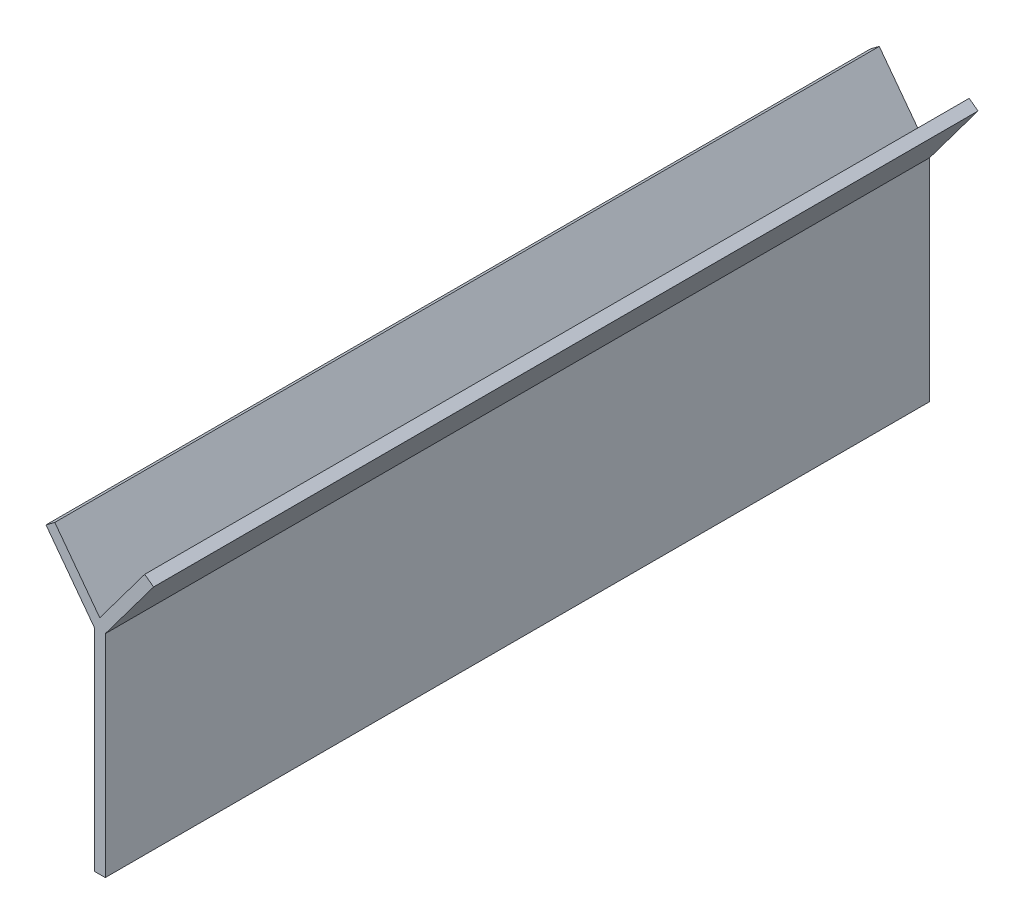
ISO-10303-21;
HEADER;
FILE_DESCRIPTION(('STEP AP214'),'2;1');
FILE_NAME('part.step','',(''),(''),'','','');
FILE_SCHEMA(('AUTOMOTIVE_DESIGN { 1 0 10303 214 1 1 1 1 }'));
ENDSEC;
DATA;
#1=APPLICATION_CONTEXT('core data for automotive mechanical design processes');
#2=APPLICATION_PROTOCOL_DEFINITION('international standard','automotive_design',2000,#1);
#3=PRODUCT_CONTEXT('',#1,'mechanical');
#4=PRODUCT('Part','Part','',(#3));
#5=PRODUCT_RELATED_PRODUCT_CATEGORY('part','',(#4));
#6=PRODUCT_DEFINITION_FORMATION('','',#4);
#7=PRODUCT_DEFINITION_CONTEXT('part definition',#1,'design');
#8=PRODUCT_DEFINITION('design','',#6,#7);
#9=PRODUCT_DEFINITION_SHAPE('','',#8);
#10=(LENGTH_UNIT() NAMED_UNIT(*) SI_UNIT(.MILLI.,.METRE.));
#11=(NAMED_UNIT(*) PLANE_ANGLE_UNIT() SI_UNIT($,.RADIAN.));
#12=(NAMED_UNIT(*) SI_UNIT($,.STERADIAN.) SOLID_ANGLE_UNIT());
#13=UNCERTAINTY_MEASURE_WITH_UNIT(LENGTH_MEASURE(1.E-05),#10,'distance_accuracy_value','');
#14=(GEOMETRIC_REPRESENTATION_CONTEXT(3) GLOBAL_UNCERTAINTY_ASSIGNED_CONTEXT((#13)) GLOBAL_UNIT_ASSIGNED_CONTEXT((#10,
#11,#12)) REPRESENTATION_CONTEXT('',''));
#15=CARTESIAN_POINT('',(0.,0.,0.));
#16=DIRECTION('',(0.,0.,1.));
#17=DIRECTION('',(1.,0.,0.));
#18=AXIS2_PLACEMENT_3D('',#15,#16,#17);
#19=CARTESIAN_POINT('',(0.,3.34000374251287,400.));
#20=DIRECTION('',(0.800897306177102,-0.598801724244563,0.));
#21=DIRECTION('',(0.598801724244562,0.800897306177102,0.));
#22=AXIS2_PLACEMENT_3D('',#19,#20,#21);
#23=PLANE('',#22);
#24=DIRECTION('',(0.598801724244562,0.800897306177102,0.));
#25=VECTOR('',#24,1.);
#26=CARTESIAN_POINT('',(0.,3.34000374251287,100.));
#27=LINE('',#26,#25);
#28=CARTESIAN_POINT('',(0.,3.34000374251287,100.));
#29=VERTEX_POINT('',#28);
#30=CARTESIAN_POINT('',(16.3622571149827,25.2245226338022,100.));
#31=VERTEX_POINT('',#30);
#32=EDGE_CURVE('E53',#29,#31,#27,.T.);
#33=ORIENTED_EDGE('',*,*,#32,.F.);
#34=DIRECTION('',(0.,0.,-1.));
#35=VECTOR('',#34,1.);
#36=CARTESIAN_POINT('',(0.,3.34000374251287,400.));
#37=LINE('',#36,#35);
#38=CARTESIAN_POINT('',(0.,3.34000374251287,400.));
#39=VERTEX_POINT('',#38);
#40=EDGE_CURVE('E48',#39,#29,#37,.T.);
#41=ORIENTED_EDGE('',*,*,#40,.F.);
#42=DIRECTION('',(-0.598801724244563,-0.800897306177102,0.));
#43=VECTOR('',#42,1.);
#44=CARTESIAN_POINT('',(0.,3.34000374251287,400.));
#45=LINE('',#44,#43);
#46=CARTESIAN_POINT('',(16.3622571149827,25.2245226338022,400.));
#47=VERTEX_POINT('',#46);
#48=EDGE_CURVE('E156',#47,#39,#45,.T.);
#49=ORIENTED_EDGE('',*,*,#48,.F.);
#50=DIRECTION('',(0.,0.,-1.));
#51=VECTOR('',#50,1.);
#52=CARTESIAN_POINT('',(16.3622571149827,25.2245226338022,400.));
#53=LINE('',#52,#51);
#54=EDGE_CURVE('E127',#47,#31,#53,.T.);
#55=ORIENTED_EDGE('',*,*,#54,.T.);
#56=EDGE_LOOP('',(#33,#41,#49,#55));
#57=FACE_BOUND('',#56,.T.);
#58=ADVANCED_FACE('F41',(#57),#23,.F.);
#59=CARTESIAN_POINT('',(0.,3.34000374251287,400.));
#60=DIRECTION('',(-0.800897306177102,-0.598801724244563,0.));
#61=DIRECTION('',(0.598801724244562,-0.800897306177102,0.));
#62=AXIS2_PLACEMENT_3D('',#59,#60,#61);
#63=PLANE('',#62);
#64=DIRECTION('',(0.598801724244562,-0.800897306177102,0.));
#65=VECTOR('',#64,1.);
#66=CARTESIAN_POINT('',(0.,3.34000374251287,100.));
#67=LINE('',#66,#65);
#68=CARTESIAN_POINT('',(-16.3622571149827,25.2245226338022,100.));
#69=VERTEX_POINT('',#68);
#70=EDGE_CURVE('E155',#69,#29,#67,.T.);
#71=ORIENTED_EDGE('',*,*,#70,.F.);
#72=DIRECTION('',(0.,0.,-1.));
#73=VECTOR('',#72,1.);
#74=CARTESIAN_POINT('',(-16.3622571149827,25.2245226338022,400.));
#75=LINE('',#74,#73);
#76=CARTESIAN_POINT('',(-16.3622571149827,25.2245226338022,400.));
#77=VERTEX_POINT('',#76);
#78=EDGE_CURVE('E145',#77,#69,#75,.T.);
#79=ORIENTED_EDGE('',*,*,#78,.F.);
#80=DIRECTION('',(-0.598801724244563,0.800897306177102,0.));
#81=VECTOR('',#80,1.);
#82=CARTESIAN_POINT('',(0.,3.34000374251287,400.));
#83=LINE('',#82,#81);
#84=EDGE_CURVE('E153',#39,#77,#83,.T.);
#85=ORIENTED_EDGE('',*,*,#84,.F.);
#86=ORIENTED_EDGE('',*,*,#40,.T.);
#87=EDGE_LOOP('',(#71,#79,#85,#86));
#88=FACE_BOUND('',#87,.T.);
#89=ADVANCED_FACE('F147',(#88),#63,.F.);
#90=CARTESIAN_POINT('',(-16.3622571149827,25.2245226338022,400.));
#91=DIRECTION('',(0.598801724244563,-0.800897306177102,0.));
#92=DIRECTION('',(0.800897306177102,0.598801724244563,0.));
#93=AXIS2_PLACEMENT_3D('',#90,#91,#92);
#94=PLANE('',#93);
#95=DIRECTION('',(0.800897306177102,0.598801724244563,0.));
#96=VECTOR('',#95,1.);
#97=CARTESIAN_POINT('',(-16.3622571149827,25.2245226338022,100.));
#98=LINE('',#97,#96);
#99=CARTESIAN_POINT('',(-19.5658463396911,22.8293157368239,100.));
#100=VERTEX_POINT('',#99);
#101=EDGE_CURVE('E157',#100,#69,#98,.T.);
#102=ORIENTED_EDGE('',*,*,#101,.F.);
#103=DIRECTION('',(0.,0.,-1.));
#104=VECTOR('',#103,1.);
#105=CARTESIAN_POINT('',(-19.5658463396911,22.8293157368239,400.));
#106=LINE('',#105,#104);
#107=CARTESIAN_POINT('',(-19.5658463396911,22.8293157368239,400.));
#108=VERTEX_POINT('',#107);
#109=EDGE_CURVE('E143',#108,#100,#106,.T.);
#110=ORIENTED_EDGE('',*,*,#109,.F.);
#111=DIRECTION('',(-0.800897306177102,-0.598801724244563,0.));
#112=VECTOR('',#111,1.);
#113=CARTESIAN_POINT('',(-16.3622571149827,25.2245226338022,400.));
#114=LINE('',#113,#112);
#115=EDGE_CURVE('E163',#77,#108,#114,.T.);
#116=ORIENTED_EDGE('',*,*,#115,.F.);
#117=ORIENTED_EDGE('',*,*,#78,.T.);
#118=EDGE_LOOP('',(#102,#110,#116,#117));
#119=FACE_BOUND('',#118,.T.);
#120=ADVANCED_FACE('F192',(#119),#94,.F.);
#121=CARTESIAN_POINT('',(-2.,-0.665003742512873,400.));
#122=DIRECTION('',(0.800897306177102,0.598801724244562,0.));
#123=DIRECTION('',(-0.598801724244563,0.800897306177102,0.));
#124=AXIS2_PLACEMENT_3D('',#121,#122,#123);
#125=PLANE('',#124);
#126=DIRECTION('',(-0.598801724244563,0.800897306177102,0.));
#127=VECTOR('',#126,1.);
#128=CARTESIAN_POINT('',(-2.,-0.665003742512873,100.));
#129=LINE('',#128,#127);
#130=CARTESIAN_POINT('',(-2.,-0.665003742512873,100.));
#131=VERTEX_POINT('',#130);
#132=EDGE_CURVE('E189',#131,#100,#129,.T.);
#133=ORIENTED_EDGE('',*,*,#132,.F.);
#134=DIRECTION('',(0.,0.,-1.));
#135=VECTOR('',#134,1.);
#136=CARTESIAN_POINT('',(-2.,-0.665003742512873,400.));
#137=LINE('',#136,#135);
#138=CARTESIAN_POINT('',(-2.,-0.665003742512873,400.));
#139=VERTEX_POINT('',#138);
#140=EDGE_CURVE('E137',#139,#131,#137,.T.);
#141=ORIENTED_EDGE('',*,*,#140,.F.);
#142=DIRECTION('',(0.598801724244563,-0.800897306177102,0.));
#143=VECTOR('',#142,1.);
#144=CARTESIAN_POINT('',(-2.,-0.665003742512873,400.));
#145=LINE('',#144,#143);
#146=EDGE_CURVE('E167',#108,#139,#145,.T.);
#147=ORIENTED_EDGE('',*,*,#146,.F.);
#148=ORIENTED_EDGE('',*,*,#109,.T.);
#149=EDGE_LOOP('',(#133,#141,#147,#148));
#150=FACE_BOUND('',#149,.T.);
#151=ADVANCED_FACE('F197',(#150),#125,.F.);
#152=CARTESIAN_POINT('',(-2.,-0.665003742512873,400.));
#153=DIRECTION('',(1.,0.,0.));
#154=DIRECTION('',(0.,0.,-1.));
#155=AXIS2_PLACEMENT_3D('',#152,#153,#154);
#156=PLANE('',#155);
#157=DIRECTION('',(0.,1.,0.));
#158=VECTOR('',#157,1.);
#159=CARTESIAN_POINT('',(-2.,-0.665003742512873,100.));
#160=LINE('',#159,#158);
#161=CARTESIAN_POINT('',(-2.,-77.540147309179,100.));
#162=VERTEX_POINT('',#161);
#163=EDGE_CURVE('E184',#162,#131,#160,.T.);
#164=ORIENTED_EDGE('',*,*,#163,.F.);
#165=DIRECTION('',(0.,0.,-1.));
#166=VECTOR('',#165,1.);
#167=CARTESIAN_POINT('',(-2.,-77.540147309179,400.));
#168=LINE('',#167,#166);
#169=CARTESIAN_POINT('',(-2.,-77.540147309179,400.));
#170=VERTEX_POINT('',#169);
#171=EDGE_CURVE('E135',#170,#162,#168,.T.);
#172=ORIENTED_EDGE('',*,*,#171,.F.);
#173=DIRECTION('',(0.,-1.,0.));
#174=VECTOR('',#173,1.);
#175=CARTESIAN_POINT('',(-2.,-0.665003742512873,400.));
#176=LINE('',#175,#174);
#177=EDGE_CURVE('E169',#139,#170,#176,.T.);
#178=ORIENTED_EDGE('',*,*,#177,.F.);
#179=ORIENTED_EDGE('',*,*,#140,.T.);
#180=EDGE_LOOP('',(#164,#172,#178,#179));
#181=FACE_BOUND('',#180,.T.);
#182=ADVANCED_FACE('F201',(#181),#156,.F.);
#183=CARTESIAN_POINT('',(-2.,-77.540147309179,400.));
#184=DIRECTION('',(0.,1.,0.));
#185=DIRECTION('',(0.,0.,1.));
#186=AXIS2_PLACEMENT_3D('',#183,#184,#185);
#187=PLANE('',#186);
#188=DIRECTION('',(-1.,0.,0.));
#189=VECTOR('',#188,1.);
#190=CARTESIAN_POINT('',(-2.,-77.540147309179,100.));
#191=LINE('',#190,#189);
#192=CARTESIAN_POINT('',(2.,-77.540147309179,100.));
#193=VERTEX_POINT('',#192);
#194=EDGE_CURVE('E185',#193,#162,#191,.T.);
#195=ORIENTED_EDGE('',*,*,#194,.F.);
#196=DIRECTION('',(0.,0.,-1.));
#197=VECTOR('',#196,1.);
#198=CARTESIAN_POINT('',(2.,-77.540147309179,400.));
#199=LINE('',#198,#197);
#200=CARTESIAN_POINT('',(2.,-77.540147309179,400.));
#201=VERTEX_POINT('',#200);
#202=EDGE_CURVE('E126',#201,#193,#199,.T.);
#203=ORIENTED_EDGE('',*,*,#202,.F.);
#204=DIRECTION('',(1.,0.,0.));
#205=VECTOR('',#204,1.);
#206=CARTESIAN_POINT('',(-2.,-77.540147309179,400.));
#207=LINE('',#206,#205);
#208=EDGE_CURVE('E168',#170,#201,#207,.T.);
#209=ORIENTED_EDGE('',*,*,#208,.F.);
#210=ORIENTED_EDGE('',*,*,#171,.T.);
#211=EDGE_LOOP('',(#195,#203,#209,#210));
#212=FACE_BOUND('',#211,.T.);
#213=ADVANCED_FACE('F202',(#212),#187,.F.);
#214=CARTESIAN_POINT('',(2.,-0.665003742512874,400.));
#215=DIRECTION('',(-1.,0.,0.));
#216=DIRECTION('',(0.,0.,1.));
#217=AXIS2_PLACEMENT_3D('',#214,#215,#216);
#218=PLANE('',#217);
#219=DIRECTION('',(0.,-1.,0.));
#220=VECTOR('',#219,1.);
#221=CARTESIAN_POINT('',(2.,-0.665003742512874,100.));
#222=LINE('',#221,#220);
#223=CARTESIAN_POINT('',(2.,-0.665003742512874,100.));
#224=VERTEX_POINT('',#223);
#225=EDGE_CURVE('E122',#224,#193,#222,.T.);
#226=ORIENTED_EDGE('',*,*,#225,.F.);
#227=DIRECTION('',(0.,0.,-1.));
#228=VECTOR('',#227,1.);
#229=CARTESIAN_POINT('',(2.,-0.665003742512874,400.));
#230=LINE('',#229,#228);
#231=CARTESIAN_POINT('',(2.,-0.665003742512874,400.));
#232=VERTEX_POINT('',#231);
#233=EDGE_CURVE('E125',#232,#224,#230,.T.);
#234=ORIENTED_EDGE('',*,*,#233,.F.);
#235=DIRECTION('',(0.,1.,0.));
#236=VECTOR('',#235,1.);
#237=CARTESIAN_POINT('',(2.,-0.665003742512874,400.));
#238=LINE('',#237,#236);
#239=EDGE_CURVE('E172',#201,#232,#238,.T.);
#240=ORIENTED_EDGE('',*,*,#239,.F.);
#241=ORIENTED_EDGE('',*,*,#202,.T.);
#242=EDGE_LOOP('',(#226,#234,#240,#241));
#243=FACE_BOUND('',#242,.T.);
#244=ADVANCED_FACE('F179',(#243),#218,.F.);
#245=CARTESIAN_POINT('',(2.,-0.665003742512874,400.));
#246=DIRECTION('',(-0.800897306177102,0.598801724244563,0.));
#247=DIRECTION('',(-0.598801724244563,-0.800897306177102,0.));
#248=AXIS2_PLACEMENT_3D('',#245,#246,#247);
#249=PLANE('',#248);
#250=DIRECTION('',(-0.598801724244563,-0.800897306177102,0.));
#251=VECTOR('',#250,1.);
#252=CARTESIAN_POINT('',(2.,-0.665003742512874,100.));
#253=LINE('',#252,#251);
#254=CARTESIAN_POINT('',(19.5658463396911,22.8293157368239,100.));
#255=VERTEX_POINT('',#254);
#256=EDGE_CURVE('E109',#255,#224,#253,.T.);
#257=ORIENTED_EDGE('',*,*,#256,.F.);
#258=DIRECTION('',(0.,0.,-1.));
#259=VECTOR('',#258,1.);
#260=CARTESIAN_POINT('',(19.5658463396911,22.8293157368239,400.));
#261=LINE('',#260,#259);
#262=CARTESIAN_POINT('',(19.5658463396911,22.8293157368239,400.));
#263=VERTEX_POINT('',#262);
#264=EDGE_CURVE('E120',#263,#255,#261,.T.);
#265=ORIENTED_EDGE('',*,*,#264,.F.);
#266=DIRECTION('',(0.598801724244563,0.800897306177102,0.));
#267=VECTOR('',#266,1.);
#268=CARTESIAN_POINT('',(2.,-0.665003742512874,400.));
#269=LINE('',#268,#267);
#270=EDGE_CURVE('E173',#232,#263,#269,.T.);
#271=ORIENTED_EDGE('',*,*,#270,.F.);
#272=ORIENTED_EDGE('',*,*,#233,.T.);
#273=EDGE_LOOP('',(#257,#265,#271,#272));
#274=FACE_BOUND('',#273,.T.);
#275=ADVANCED_FACE('F119',(#274),#249,.F.);
#276=CARTESIAN_POINT('',(16.3622571149827,25.2245226338022,400.));
#277=DIRECTION('',(-0.598801724244563,-0.800897306177102,0.));
#278=DIRECTION('',(0.800897306177102,-0.598801724244563,0.));
#279=AXIS2_PLACEMENT_3D('',#276,#277,#278);
#280=PLANE('',#279);
#281=DIRECTION('',(0.800897306177102,-0.598801724244563,0.));
#282=VECTOR('',#281,1.);
#283=CARTESIAN_POINT('',(16.3622571149827,25.2245226338022,100.));
#284=LINE('',#283,#282);
#285=EDGE_CURVE('E11',#31,#255,#284,.T.);
#286=ORIENTED_EDGE('',*,*,#285,.F.);
#287=ORIENTED_EDGE('',*,*,#54,.F.);
#288=DIRECTION('',(-0.800897306177102,0.598801724244563,0.));
#289=VECTOR('',#288,1.);
#290=CARTESIAN_POINT('',(16.3622571149827,25.2245226338022,400.));
#291=LINE('',#290,#289);
#292=EDGE_CURVE('E62',#263,#47,#291,.T.);
#293=ORIENTED_EDGE('',*,*,#292,.F.);
#294=ORIENTED_EDGE('',*,*,#264,.T.);
#295=EDGE_LOOP('',(#286,#287,#293,#294));
#296=FACE_BOUND('',#295,.T.);
#297=ADVANCED_FACE('F124',(#296),#280,.F.);
#298=CARTESIAN_POINT('',(0.,0.,400.));
#299=DIRECTION('',(0.,0.,-1.));
#300=DIRECTION('',(-1.,0.,0.));
#301=AXIS2_PLACEMENT_3D('',#298,#299,#300);
#302=PLANE('',#301);
#303=ORIENTED_EDGE('',*,*,#48,.T.);
#304=ORIENTED_EDGE('',*,*,#84,.T.);
#305=ORIENTED_EDGE('',*,*,#115,.T.);
#306=ORIENTED_EDGE('',*,*,#146,.T.);
#307=ORIENTED_EDGE('',*,*,#177,.T.);
#308=ORIENTED_EDGE('',*,*,#208,.T.);
#309=ORIENTED_EDGE('',*,*,#239,.T.);
#310=ORIENTED_EDGE('',*,*,#270,.T.);
#311=ORIENTED_EDGE('',*,*,#292,.T.);
#312=EDGE_LOOP('',(#303,#304,#305,#306,#307,#308,#309,#310,#311));
#313=FACE_BOUND('',#312,.T.);
#314=ADVANCED_FACE('F175',(#313),#302,.F.);
#315=CARTESIAN_POINT('',(0.,-10.3245361859908,100.));
#316=DIRECTION('',(0.,0.,-1.));
#317=DIRECTION('',(-1.,0.,0.));
#318=AXIS2_PLACEMENT_3D('',#315,#316,#317);
#319=PLANE('',#318);
#320=ORIENTED_EDGE('',*,*,#32,.T.);
#321=ORIENTED_EDGE('',*,*,#285,.T.);
#322=ORIENTED_EDGE('',*,*,#256,.T.);
#323=ORIENTED_EDGE('',*,*,#225,.T.);
#324=ORIENTED_EDGE('',*,*,#194,.T.);
#325=ORIENTED_EDGE('',*,*,#163,.T.);
#326=ORIENTED_EDGE('',*,*,#132,.T.);
#327=ORIENTED_EDGE('',*,*,#101,.T.);
#328=ORIENTED_EDGE('',*,*,#70,.T.);
#329=EDGE_LOOP('',(#320,#321,#322,#323,#324,#325,#326,#327,#328));
#330=FACE_BOUND('',#329,.T.);
#331=ADVANCED_FACE('F108',(#330),#319,.T.);
#332=CLOSED_SHELL('',(#58,#89,#120,#151,#182,#213,#244,#275,#297,#314,#331));
#333=MANIFOLD_SOLID_BREP('B2',#332);
#334=ADVANCED_BREP_SHAPE_REPRESENTATION('',(#18,#333),#14);
#335=SHAPE_DEFINITION_REPRESENTATION(#9,#334);
ENDSEC;
END-ISO-10303-21;
